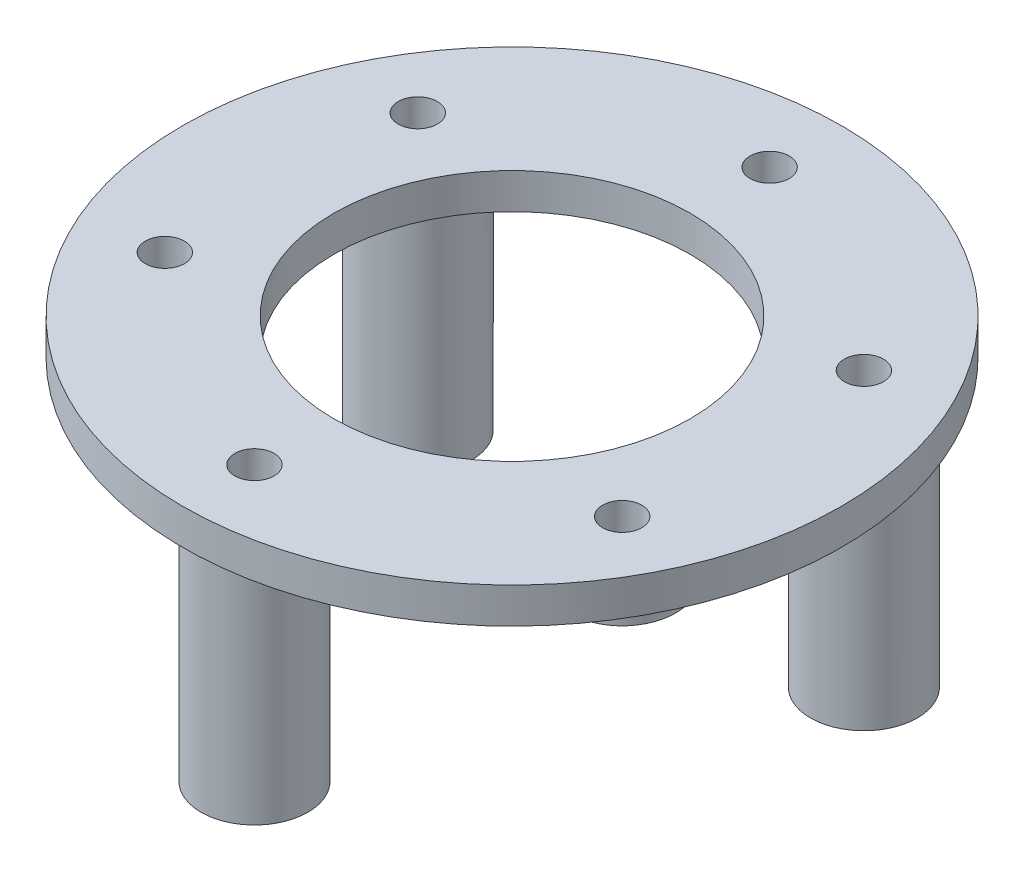
ISO-10303-21;
HEADER;
FILE_DESCRIPTION(('STEP AP214'),'2;1');
FILE_NAME('part.step','',(''),(''),'','','');
FILE_SCHEMA(('AUTOMOTIVE_DESIGN { 1 0 10303 214 1 1 1 1 }'));
ENDSEC;
DATA;
#1=APPLICATION_CONTEXT('core data for automotive mechanical design processes');
#2=APPLICATION_PROTOCOL_DEFINITION('international standard','automotive_design',2000,#1);
#3=PRODUCT_CONTEXT('',#1,'mechanical');
#4=PRODUCT('Part','Part','',(#3));
#5=PRODUCT_RELATED_PRODUCT_CATEGORY('part','',(#4));
#6=PRODUCT_DEFINITION_FORMATION('','',#4);
#7=PRODUCT_DEFINITION_CONTEXT('part definition',#1,'design');
#8=PRODUCT_DEFINITION('design','',#6,#7);
#9=PRODUCT_DEFINITION_SHAPE('','',#8);
#10=(LENGTH_UNIT() NAMED_UNIT(*) SI_UNIT(.MILLI.,.METRE.));
#11=(NAMED_UNIT(*) PLANE_ANGLE_UNIT() SI_UNIT($,.RADIAN.));
#12=(NAMED_UNIT(*) SI_UNIT($,.STERADIAN.) SOLID_ANGLE_UNIT());
#13=UNCERTAINTY_MEASURE_WITH_UNIT(LENGTH_MEASURE(1.E-05),#10,'distance_accuracy_value','');
#14=(GEOMETRIC_REPRESENTATION_CONTEXT(3) GLOBAL_UNCERTAINTY_ASSIGNED_CONTEXT((#13)) GLOBAL_UNIT_ASSIGNED_CONTEXT((#10,
#11,#12)) REPRESENTATION_CONTEXT('',''));
#15=CARTESIAN_POINT('',(0.,0.,0.));
#16=DIRECTION('',(0.,0.,1.));
#17=DIRECTION('',(1.,0.,0.));
#18=AXIS2_PLACEMENT_3D('',#15,#16,#17);
#19=CARTESIAN_POINT('',(0.,0.,0.));
#20=DIRECTION('',(0.,1.,0.));
#21=DIRECTION('',(0.,0.,1.));
#22=AXIS2_PLACEMENT_3D('',#19,#20,#21);
#23=PLANE('',#22);
#24=CARTESIAN_POINT('',(0.,0.,14.46));
#25=DIRECTION('',(0.,1.,0.));
#26=DIRECTION('',(0.,0.,1.));
#27=AXIS2_PLACEMENT_3D('',#24,#25,#26);
#28=CIRCLE('',#27,3.);
#29=CARTESIAN_POINT('',(0.,0.,17.46));
#30=VERTEX_POINT('',#29);
#31=EDGE_CURVE('E177',#30,#30,#28,.F.);
#32=ORIENTED_EDGE('',*,*,#31,.F.);
#33=EDGE_LOOP('',(#32));
#34=FACE_BOUND('',#33,.T.);
#35=CARTESIAN_POINT('',(0.,0.,0.));
#36=DIRECTION('',(0.,1.,0.));
#37=DIRECTION('',(0.,0.,1.));
#38=AXIS2_PLACEMENT_3D('',#35,#36,#37);
#39=CIRCLE('',#38,10.);
#40=CARTESIAN_POINT('',(0.,0.,10.));
#41=VERTEX_POINT('',#40);
#42=EDGE_CURVE('E162',#41,#41,#39,.T.);
#43=ORIENTED_EDGE('',*,*,#42,.T.);
#44=EDGE_LOOP('',(#43));
#45=FACE_BOUND('',#44,.T.);
#46=DIRECTION('',(-0.866025403784438,0.,0.5));
#47=VECTOR('',#46,1.);
#48=CARTESIAN_POINT('',(-6.38397459621556,0.,-13.0573683548744));
#49=LINE('',#48,#47);
#50=CARTESIAN_POINT('',(-6.38397459621556,0.,-13.0573683548744));
#51=VERTEX_POINT('',#50);
#52=CARTESIAN_POINT('',(-8.11602540378444,0.,-12.0573683548744));
#53=VERTEX_POINT('',#52);
#54=EDGE_CURVE('E79',#51,#53,#49,.T.);
#55=ORIENTED_EDGE('',*,*,#54,.F.);
#56=DIRECTION('',(0.5,0.,0.866025403784439));
#57=VECTOR('',#56,1.);
#58=CARTESIAN_POINT('',(-8.38397459621556,0.,-16.5214699700121));
#59=LINE('',#58,#57);
#60=CARTESIAN_POINT('',(-8.37045119717114,0.,-16.4980467557762));
#61=VERTEX_POINT('',#60);
#62=EDGE_CURVE('E90',#61,#51,#59,.T.);
#63=ORIENTED_EDGE('',*,*,#62,.F.);
#64=CARTESIAN_POINT('',(0.,0.,0.));
#65=DIRECTION('',(0.,1.,0.));
#66=DIRECTION('',(0.,0.,1.));
#67=AXIS2_PLACEMENT_3D('',#64,#65,#66);
#68=CIRCLE('',#67,18.5);
#69=CARTESIAN_POINT('',(-10.10250200474,0.,-15.4980467557762));
#70=VERTEX_POINT('',#69);
#71=EDGE_CURVE('E166',#70,#61,#68,.T.);
#72=ORIENTED_EDGE('',*,*,#71,.F.);
#73=DIRECTION('',(-0.5,0.,-0.866025403784438));
#74=VECTOR('',#73,1.);
#75=CARTESIAN_POINT('',(-10.1160254037844,0.,-15.5214699700121));
#76=LINE('',#75,#74);
#77=EDGE_CURVE('E92',#53,#70,#76,.T.);
#78=ORIENTED_EDGE('',*,*,#77,.F.);
#79=EDGE_LOOP('',(#55,#63,#72,#78));
#80=FACE_BOUND('',#79,.T.);
#81=CARTESIAN_POINT('',(0.,0.,-14.46));
#82=DIRECTION('',(0.,1.,0.));
#83=DIRECTION('',(0.,0.,1.));
#84=AXIS2_PLACEMENT_3D('',#81,#82,#83);
#85=CIRCLE('',#84,3.);
#86=CARTESIAN_POINT('',(0.,0.,-11.46));
#87=VERTEX_POINT('',#86);
#88=EDGE_CURVE('E147',#87,#87,#85,.T.);
#89=ORIENTED_EDGE('',*,*,#88,.T.);
#90=EDGE_LOOP('',(#89));
#91=FACE_BOUND('',#90,.T.);
#92=CARTESIAN_POINT('',(-12.8378104690723,0.,6.65448888797456));
#93=DIRECTION('',(0.,1.,0.));
#94=DIRECTION('',(0.,0.,1.));
#95=AXIS2_PLACEMENT_3D('',#92,#93,#94);
#96=CIRCLE('',#95,3.);
#97=CARTESIAN_POINT('',(-12.8378104690723,0.,9.65448888797456));
#98=VERTEX_POINT('',#97);
#99=EDGE_CURVE('E138',#98,#98,#96,.T.);
#100=ORIENTED_EDGE('',*,*,#99,.T.);
#101=EDGE_LOOP('',(#100));
#102=FACE_BOUND('',#101,.T.);
#103=CARTESIAN_POINT('',(12.8378104690723,0.,6.65448888797456));
#104=DIRECTION('',(0.,1.,0.));
#105=DIRECTION('',(0.,0.,1.));
#106=AXIS2_PLACEMENT_3D('',#103,#104,#105);
#107=CIRCLE('',#106,3.);
#108=CARTESIAN_POINT('',(12.8378104690723,0.,9.65448888797456));
#109=VERTEX_POINT('',#108);
#110=EDGE_CURVE('E129',#109,#109,#107,.T.);
#111=ORIENTED_EDGE('',*,*,#110,.T.);
#112=EDGE_LOOP('',(#111));
#113=FACE_BOUND('',#112,.T.);
#114=CARTESIAN_POINT('',(-12.5227273387229,0.,-7.23000000000006));
#115=DIRECTION('',(0.,1.,0.));
#116=DIRECTION('',(0.,0.,1.));
#117=AXIS2_PLACEMENT_3D('',#114,#115,#116);
#118=CIRCLE('',#117,3.);
#119=CARTESIAN_POINT('',(-12.5227273387229,0.,-4.23000000000006));
#120=VERTEX_POINT('',#119);
#121=EDGE_CURVE('E172',#120,#120,#118,.F.);
#122=ORIENTED_EDGE('',*,*,#121,.F.);
#123=EDGE_LOOP('',(#122));
#124=FACE_BOUND('',#123,.T.);
#125=CARTESIAN_POINT('',(12.5227273387229,0.,-7.23000000000006));
#126=DIRECTION('',(0.,1.,0.));
#127=DIRECTION('',(0.,0.,1.));
#128=AXIS2_PLACEMENT_3D('',#125,#126,#127);
#129=CIRCLE('',#128,3.);
#130=CARTESIAN_POINT('',(12.5227273387229,0.,-4.23000000000007));
#131=VERTEX_POINT('',#130);
#132=EDGE_CURVE('E180',#131,#131,#129,.F.);
#133=ORIENTED_EDGE('',*,*,#132,.F.);
#134=EDGE_LOOP('',(#133));
#135=FACE_BOUND('',#134,.T.);
#136=ADVANCED_FACE('F33',(#34,#45,#80,#91,#102,#113,#124,#135),#23,.F.);
#137=CARTESIAN_POINT('',(0.,2.,0.));
#138=DIRECTION('',(0.,1.,0.));
#139=DIRECTION('',(0.,0.,1.));
#140=AXIS2_PLACEMENT_3D('',#137,#138,#139);
#141=PLANE('',#140);
#142=CARTESIAN_POINT('',(-12.5227273387229,2.,-7.23000000000006));
#143=DIRECTION('',(0.,1.,0.));
#144=DIRECTION('',(0.,0.,1.));
#145=AXIS2_PLACEMENT_3D('',#142,#143,#144);
#146=CIRCLE('',#145,1.10000000000001);
#147=CARTESIAN_POINT('',(-12.5227273387229,2.,-6.13000000000005));
#148=VERTEX_POINT('',#147);
#149=EDGE_CURVE('E118',#148,#148,#146,.T.);
#150=ORIENTED_EDGE('',*,*,#149,.F.);
#151=EDGE_LOOP('',(#150));
#152=FACE_BOUND('',#151,.T.);
#153=CARTESIAN_POINT('',(12.5227273387229,2.,-7.23000000000006));
#154=DIRECTION('',(0.,1.,0.));
#155=DIRECTION('',(0.,0.,1.));
#156=AXIS2_PLACEMENT_3D('',#153,#154,#155);
#157=CIRCLE('',#156,1.1);
#158=CARTESIAN_POINT('',(12.5227273387229,2.,-6.13000000000006));
#159=VERTEX_POINT('',#158);
#160=EDGE_CURVE('E122',#159,#159,#157,.T.);
#161=ORIENTED_EDGE('',*,*,#160,.F.);
#162=EDGE_LOOP('',(#161));
#163=FACE_BOUND('',#162,.T.);
#164=CARTESIAN_POINT('',(0.,2.,14.46));
#165=DIRECTION('',(0.,1.,0.));
#166=DIRECTION('',(0.,0.,1.));
#167=AXIS2_PLACEMENT_3D('',#164,#165,#166);
#168=CIRCLE('',#167,1.1);
#169=CARTESIAN_POINT('',(0.,2.,15.56));
#170=VERTEX_POINT('',#169);
#171=EDGE_CURVE('E117',#170,#170,#168,.T.);
#172=ORIENTED_EDGE('',*,*,#171,.F.);
#173=EDGE_LOOP('',(#172));
#174=FACE_BOUND('',#173,.T.);
#175=CARTESIAN_POINT('',(12.8378104690723,2.,6.65448888797456));
#176=DIRECTION('',(0.,1.,0.));
#177=DIRECTION('',(0.,0.,1.));
#178=AXIS2_PLACEMENT_3D('',#175,#176,#177);
#179=CIRCLE('',#178,1.1);
#180=CARTESIAN_POINT('',(12.8378104690723,2.,7.75448888797456));
#181=VERTEX_POINT('',#180);
#182=EDGE_CURVE('E156',#181,#181,#179,.T.);
#183=ORIENTED_EDGE('',*,*,#182,.F.);
#184=EDGE_LOOP('',(#183));
#185=FACE_BOUND('',#184,.T.);
#186=CARTESIAN_POINT('',(0.,2.,0.));
#187=DIRECTION('',(0.,1.,0.));
#188=DIRECTION('',(0.,0.,1.));
#189=AXIS2_PLACEMENT_3D('',#186,#187,#188);
#190=CIRCLE('',#189,10.);
#191=CARTESIAN_POINT('',(0.,2.,10.));
#192=VERTEX_POINT('',#191);
#193=EDGE_CURVE('E163',#192,#192,#190,.T.);
#194=ORIENTED_EDGE('',*,*,#193,.F.);
#195=EDGE_LOOP('',(#194));
#196=FACE_BOUND('',#195,.T.);
#197=CARTESIAN_POINT('',(0.,2.,0.));
#198=DIRECTION('',(0.,1.,0.));
#199=DIRECTION('',(0.,0.,1.));
#200=AXIS2_PLACEMENT_3D('',#197,#198,#199);
#201=CIRCLE('',#200,18.5);
#202=CARTESIAN_POINT('',(0.,2.,18.5));
#203=VERTEX_POINT('',#202);
#204=EDGE_CURVE('E169',#203,#203,#201,.T.);
#205=ORIENTED_EDGE('',*,*,#204,.T.);
#206=EDGE_LOOP('',(#205));
#207=FACE_BOUND('',#206,.T.);
#208=CARTESIAN_POINT('',(0.,2.,-14.46));
#209=DIRECTION('',(0.,1.,0.));
#210=DIRECTION('',(0.,0.,1.));
#211=AXIS2_PLACEMENT_3D('',#208,#209,#210);
#212=CIRCLE('',#211,1.1);
#213=CARTESIAN_POINT('',(0.,2.,-13.36));
#214=VERTEX_POINT('',#213);
#215=EDGE_CURVE('E159',#214,#214,#212,.T.);
#216=ORIENTED_EDGE('',*,*,#215,.F.);
#217=EDGE_LOOP('',(#216));
#218=FACE_BOUND('',#217,.T.);
#219=CARTESIAN_POINT('',(-12.8378104690723,2.,6.65448888797456));
#220=DIRECTION('',(0.,1.,0.));
#221=DIRECTION('',(0.,0.,1.));
#222=AXIS2_PLACEMENT_3D('',#219,#220,#221);
#223=CIRCLE('',#222,1.1);
#224=CARTESIAN_POINT('',(-12.8378104690723,2.,7.75448888797456));
#225=VERTEX_POINT('',#224);
#226=EDGE_CURVE('E151',#225,#225,#223,.T.);
#227=ORIENTED_EDGE('',*,*,#226,.F.);
#228=EDGE_LOOP('',(#227));
#229=FACE_BOUND('',#228,.T.);
#230=ADVANCED_FACE('F204',(#152,#163,#174,#185,#196,#207,#218,#229),#141,.T.);
#231=CARTESIAN_POINT('',(0.,2.,0.));
#232=DIRECTION('',(0.,-1.,0.));
#233=DIRECTION('',(0.,0.,-1.));
#234=AXIS2_PLACEMENT_3D('',#231,#232,#233);
#235=CYLINDRICAL_SURFACE('',#234,18.5);
#236=ORIENTED_EDGE('',*,*,#71,.T.);
#237=DIRECTION('',(0.,-1.,0.));
#238=VECTOR('',#237,1.);
#239=CARTESIAN_POINT('',(-8.37045119717114,2.,-16.4980467557762));
#240=LINE('',#239,#238);
#241=CARTESIAN_POINT('',(-8.37045119717114,0.44,-16.4980467557762));
#242=VERTEX_POINT('',#241);
#243=EDGE_CURVE('E11',#61,#242,#240,.F.);
#244=ORIENTED_EDGE('',*,*,#243,.T.);
#245=CARTESIAN_POINT('',(0.,0.44,0.));
#246=DIRECTION('',(0.,1.,0.));
#247=DIRECTION('',(0.,0.,1.));
#248=AXIS2_PLACEMENT_3D('',#245,#246,#247);
#249=CIRCLE('',#248,18.5);
#250=CARTESIAN_POINT('',(-10.10250200474,0.44,-15.4980467557762));
#251=VERTEX_POINT('',#250);
#252=EDGE_CURVE('E53',#242,#251,#249,.T.);
#253=ORIENTED_EDGE('',*,*,#252,.T.);
#254=DIRECTION('',(0.,-1.,0.));
#255=VECTOR('',#254,1.);
#256=CARTESIAN_POINT('',(-10.10250200474,2.,-15.4980467557762));
#257=LINE('',#256,#255);
#258=EDGE_CURVE('E41',#251,#70,#257,.T.);
#259=ORIENTED_EDGE('',*,*,#258,.T.);
#260=EDGE_LOOP('',(#236,#244,#253,#259));
#261=FACE_BOUND('',#260,.T.);
#262=ORIENTED_EDGE('',*,*,#204,.F.);
#263=EDGE_LOOP('',(#262));
#264=FACE_BOUND('',#263,.T.);
#265=ADVANCED_FACE('F35',(#261,#264),#235,.T.);
#266=CARTESIAN_POINT('',(0.,2.,0.));
#267=DIRECTION('',(0.,-1.,0.));
#268=DIRECTION('',(0.,0.,-1.));
#269=AXIS2_PLACEMENT_3D('',#266,#267,#268);
#270=CYLINDRICAL_SURFACE('',#269,10.);
#271=ORIENTED_EDGE('',*,*,#193,.T.);
#272=EDGE_LOOP('',(#271));
#273=FACE_BOUND('',#272,.T.);
#274=ORIENTED_EDGE('',*,*,#42,.F.);
#275=EDGE_LOOP('',(#274));
#276=FACE_BOUND('',#275,.T.);
#277=ADVANCED_FACE('F216',(#273,#276),#270,.F.);
#278=CARTESIAN_POINT('',(0.,2.,-14.46));
#279=DIRECTION('',(0.,-1.,0.));
#280=DIRECTION('',(0.,0.,-1.));
#281=AXIS2_PLACEMENT_3D('',#278,#279,#280);
#282=CYLINDRICAL_SURFACE('',#281,1.1);
#283=ORIENTED_EDGE('',*,*,#215,.T.);
#284=EDGE_LOOP('',(#283));
#285=FACE_BOUND('',#284,.T.);
#286=CARTESIAN_POINT('',(0.,-1.2,-14.46));
#287=DIRECTION('',(0.,1.,0.));
#288=DIRECTION('',(0.,0.,1.));
#289=AXIS2_PLACEMENT_3D('',#286,#287,#288);
#290=CIRCLE('',#289,1.1);
#291=CARTESIAN_POINT('',(0.,-1.2,-13.36));
#292=VERTEX_POINT('',#291);
#293=EDGE_CURVE('E142',#292,#292,#290,.T.);
#294=ORIENTED_EDGE('',*,*,#293,.F.);
#295=EDGE_LOOP('',(#294));
#296=FACE_BOUND('',#295,.T.);
#297=ADVANCED_FACE('F219',(#285,#296),#282,.F.);
#298=CARTESIAN_POINT('',(12.8378104690723,2.,6.65448888797456));
#299=DIRECTION('',(0.,-1.,0.));
#300=DIRECTION('',(0.,0.,-1.));
#301=AXIS2_PLACEMENT_3D('',#298,#299,#300);
#302=CYLINDRICAL_SURFACE('',#301,1.1);
#303=ORIENTED_EDGE('',*,*,#182,.T.);
#304=EDGE_LOOP('',(#303));
#305=FACE_BOUND('',#304,.T.);
#306=CARTESIAN_POINT('',(12.8378104690723,-1.2,6.65448888797456));
#307=DIRECTION('',(0.,1.,0.));
#308=DIRECTION('',(0.,0.,1.));
#309=AXIS2_PLACEMENT_3D('',#306,#307,#308);
#310=CIRCLE('',#309,1.1);
#311=CARTESIAN_POINT('',(12.8378104690723,-1.2,7.75448888797456));
#312=VERTEX_POINT('',#311);
#313=EDGE_CURVE('E121',#312,#312,#310,.T.);
#314=ORIENTED_EDGE('',*,*,#313,.F.);
#315=EDGE_LOOP('',(#314));
#316=FACE_BOUND('',#315,.T.);
#317=ADVANCED_FACE('F223',(#305,#316),#302,.F.);
#318=CARTESIAN_POINT('',(-12.8378104690723,2.,6.65448888797456));
#319=DIRECTION('',(0.,-1.,0.));
#320=DIRECTION('',(0.,0.,-1.));
#321=AXIS2_PLACEMENT_3D('',#318,#319,#320);
#322=CYLINDRICAL_SURFACE('',#321,1.1);
#323=ORIENTED_EDGE('',*,*,#226,.T.);
#324=EDGE_LOOP('',(#323));
#325=FACE_BOUND('',#324,.T.);
#326=CARTESIAN_POINT('',(-12.8378104690723,-1.2,6.65448888797456));
#327=DIRECTION('',(0.,1.,0.));
#328=DIRECTION('',(0.,0.,1.));
#329=AXIS2_PLACEMENT_3D('',#326,#327,#328);
#330=CIRCLE('',#329,1.1);
#331=CARTESIAN_POINT('',(-12.8378104690723,-1.2,7.75448888797456));
#332=VERTEX_POINT('',#331);
#333=EDGE_CURVE('E133',#332,#332,#330,.T.);
#334=ORIENTED_EDGE('',*,*,#333,.F.);
#335=EDGE_LOOP('',(#334));
#336=FACE_BOUND('',#335,.T.);
#337=ADVANCED_FACE('F227',(#325,#336),#322,.F.);
#338=CARTESIAN_POINT('',(0.,-1.2,-14.46));
#339=DIRECTION('',(0.,1.,0.));
#340=DIRECTION('',(0.,0.,1.));
#341=AXIS2_PLACEMENT_3D('',#338,#339,#340);
#342=CYLINDRICAL_SURFACE('',#341,3.);
#343=CARTESIAN_POINT('',(0.,-1.2,-14.46));
#344=DIRECTION('',(0.,1.,0.));
#345=DIRECTION('',(0.,0.,1.));
#346=AXIS2_PLACEMENT_3D('',#343,#344,#345);
#347=CIRCLE('',#346,3.);
#348=CARTESIAN_POINT('',(0.,-1.2,-11.46));
#349=VERTEX_POINT('',#348);
#350=EDGE_CURVE('E148',#349,#349,#347,.T.);
#351=ORIENTED_EDGE('',*,*,#350,.T.);
#352=EDGE_LOOP('',(#351));
#353=FACE_BOUND('',#352,.T.);
#354=ORIENTED_EDGE('',*,*,#88,.F.);
#355=EDGE_LOOP('',(#354));
#356=FACE_BOUND('',#355,.T.);
#357=ADVANCED_FACE('F231',(#353,#356),#342,.T.);
#358=CARTESIAN_POINT('',(0.,-1.2,-14.46));
#359=DIRECTION('',(0.,1.,0.));
#360=DIRECTION('',(0.,0.,1.));
#361=AXIS2_PLACEMENT_3D('',#358,#359,#360);
#362=PLANE('',#361);
#363=ORIENTED_EDGE('',*,*,#293,.T.);
#364=EDGE_LOOP('',(#363));
#365=FACE_BOUND('',#364,.T.);
#366=ORIENTED_EDGE('',*,*,#350,.F.);
#367=EDGE_LOOP('',(#366));
#368=FACE_BOUND('',#367,.T.);
#369=ADVANCED_FACE('F235',(#365,#368),#362,.F.);
#370=CARTESIAN_POINT('',(-12.8378104690723,-1.2,6.65448888797456));
#371=DIRECTION('',(0.,1.,0.));
#372=DIRECTION('',(0.,0.,1.));
#373=AXIS2_PLACEMENT_3D('',#370,#371,#372);
#374=CYLINDRICAL_SURFACE('',#373,3.);
#375=CARTESIAN_POINT('',(-12.8378104690723,-1.2,6.65448888797456));
#376=DIRECTION('',(0.,1.,0.));
#377=DIRECTION('',(0.,0.,1.));
#378=AXIS2_PLACEMENT_3D('',#375,#376,#377);
#379=CIRCLE('',#378,3.);
#380=CARTESIAN_POINT('',(-12.8378104690723,-1.2,9.65448888797456));
#381=VERTEX_POINT('',#380);
#382=EDGE_CURVE('E139',#381,#381,#379,.T.);
#383=ORIENTED_EDGE('',*,*,#382,.T.);
#384=EDGE_LOOP('',(#383));
#385=FACE_BOUND('',#384,.T.);
#386=ORIENTED_EDGE('',*,*,#99,.F.);
#387=EDGE_LOOP('',(#386));
#388=FACE_BOUND('',#387,.T.);
#389=ADVANCED_FACE('F239',(#385,#388),#374,.T.);
#390=CARTESIAN_POINT('',(-12.8378104690723,-1.2,6.65448888797456));
#391=DIRECTION('',(0.,1.,0.));
#392=DIRECTION('',(0.,0.,1.));
#393=AXIS2_PLACEMENT_3D('',#390,#391,#392);
#394=PLANE('',#393);
#395=ORIENTED_EDGE('',*,*,#333,.T.);
#396=EDGE_LOOP('',(#395));
#397=FACE_BOUND('',#396,.T.);
#398=ORIENTED_EDGE('',*,*,#382,.F.);
#399=EDGE_LOOP('',(#398));
#400=FACE_BOUND('',#399,.T.);
#401=ADVANCED_FACE('F243',(#397,#400),#394,.F.);
#402=CARTESIAN_POINT('',(12.8378104690723,-1.2,6.65448888797456));
#403=DIRECTION('',(0.,1.,0.));
#404=DIRECTION('',(0.,0.,1.));
#405=AXIS2_PLACEMENT_3D('',#402,#403,#404);
#406=CYLINDRICAL_SURFACE('',#405,3.);
#407=CARTESIAN_POINT('',(12.8378104690723,-1.2,6.65448888797456));
#408=DIRECTION('',(0.,1.,0.));
#409=DIRECTION('',(0.,0.,1.));
#410=AXIS2_PLACEMENT_3D('',#407,#408,#409);
#411=CIRCLE('',#410,3.);
#412=CARTESIAN_POINT('',(12.8378104690723,-1.2,9.65448888797456));
#413=VERTEX_POINT('',#412);
#414=EDGE_CURVE('E130',#413,#413,#411,.T.);
#415=ORIENTED_EDGE('',*,*,#414,.T.);
#416=EDGE_LOOP('',(#415));
#417=FACE_BOUND('',#416,.T.);
#418=ORIENTED_EDGE('',*,*,#110,.F.);
#419=EDGE_LOOP('',(#418));
#420=FACE_BOUND('',#419,.T.);
#421=ADVANCED_FACE('F247',(#417,#420),#406,.T.);
#422=CARTESIAN_POINT('',(12.8378104690723,-1.2,6.65448888797456));
#423=DIRECTION('',(0.,1.,0.));
#424=DIRECTION('',(0.,0.,1.));
#425=AXIS2_PLACEMENT_3D('',#422,#423,#424);
#426=PLANE('',#425);
#427=ORIENTED_EDGE('',*,*,#313,.T.);
#428=EDGE_LOOP('',(#427));
#429=FACE_BOUND('',#428,.T.);
#430=ORIENTED_EDGE('',*,*,#414,.F.);
#431=EDGE_LOOP('',(#430));
#432=FACE_BOUND('',#431,.T.);
#433=ADVANCED_FACE('F251',(#429,#432),#426,.F.);
#434=CARTESIAN_POINT('',(0.,-1.2,14.46));
#435=DIRECTION('',(0.,1.,0.));
#436=DIRECTION('',(0.,0.,1.));
#437=AXIS2_PLACEMENT_3D('',#434,#435,#436);
#438=CYLINDRICAL_SURFACE('',#437,1.1);
#439=CARTESIAN_POINT('',(0.,-13.4,14.46));
#440=DIRECTION('',(0.,-1.,0.));
#441=DIRECTION('',(0.,0.,-1.));
#442=AXIS2_PLACEMENT_3D('',#439,#440,#441);
#443=CIRCLE('',#442,1.1);
#444=CARTESIAN_POINT('',(0.,-13.4,15.56));
#445=VERTEX_POINT('',#444);
#446=EDGE_CURVE('E105',#445,#445,#443,.T.);
#447=CARTESIAN_POINT('',(0.,2.,15.56));
#448=CARTESIAN_POINT('',(0.,1.83958333333333,15.56));
#449=CARTESIAN_POINT('',(0.,1.67916666666667,15.56));
#450=CARTESIAN_POINT('',(0.,1.35833333333333,15.56));
#451=CARTESIAN_POINT('',(0.,1.19791666666667,15.56));
#452=CARTESIAN_POINT('',(0.,0.877083333333333,15.56));
#453=CARTESIAN_POINT('',(0.,0.716666666666666,15.56));
#454=CARTESIAN_POINT('',(0.,0.395833333333333,15.56));
#455=CARTESIAN_POINT('',(0.,0.235416666666666,15.56));
#456=CARTESIAN_POINT('',(0.,-0.0854166666666672,15.56));
#457=CARTESIAN_POINT('',(0.,-0.245833333333334,15.56));
#458=CARTESIAN_POINT('',(0.,-0.566666666666667,15.56));
#459=CARTESIAN_POINT('',(0.,-0.727083333333334,15.56));
#460=CARTESIAN_POINT('',(0.,-1.04791666666667,15.56));
#461=CARTESIAN_POINT('',(0.,-1.20833333333333,15.56));
#462=CARTESIAN_POINT('',(0.,-1.52916666666667,15.56));
#463=CARTESIAN_POINT('',(0.,-1.68958333333333,15.56));
#464=CARTESIAN_POINT('',(0.,-2.01041666666667,15.56));
#465=CARTESIAN_POINT('',(0.,-2.17083333333333,15.56));
#466=CARTESIAN_POINT('',(0.,-2.49166666666667,15.56));
#467=CARTESIAN_POINT('',(0.,-2.65208333333333,15.56));
#468=CARTESIAN_POINT('',(0.,-2.97291666666667,15.56));
#469=CARTESIAN_POINT('',(0.,-3.13333333333333,15.56));
#470=CARTESIAN_POINT('',(0.,-3.45416666666667,15.56));
#471=CARTESIAN_POINT('',(0.,-3.61458333333333,15.56));
#472=CARTESIAN_POINT('',(0.,-3.93541666666667,15.56));
#473=CARTESIAN_POINT('',(0.,-4.09583333333333,15.56));
#474=CARTESIAN_POINT('',(0.,-4.41666666666667,15.56));
#475=CARTESIAN_POINT('',(0.,-4.57708333333333,15.56));
#476=CARTESIAN_POINT('',(0.,-4.89791666666667,15.56));
#477=CARTESIAN_POINT('',(0.,-5.05833333333333,15.56));
#478=CARTESIAN_POINT('',(0.,-5.37916666666667,15.56));
#479=CARTESIAN_POINT('',(0.,-5.53958333333333,15.56));
#480=CARTESIAN_POINT('',(0.,-5.86041666666667,15.56));
#481=CARTESIAN_POINT('',(0.,-6.02083333333333,15.56));
#482=CARTESIAN_POINT('',(0.,-6.34166666666667,15.56));
#483=CARTESIAN_POINT('',(0.,-6.50208333333333,15.56));
#484=CARTESIAN_POINT('',(0.,-6.82291666666667,15.56));
#485=CARTESIAN_POINT('',(0.,-6.98333333333333,15.56));
#486=CARTESIAN_POINT('',(0.,-7.30416666666667,15.56));
#487=CARTESIAN_POINT('',(0.,-7.46458333333333,15.56));
#488=CARTESIAN_POINT('',(0.,-7.78541666666667,15.56));
#489=CARTESIAN_POINT('',(0.,-7.94583333333333,15.56));
#490=CARTESIAN_POINT('',(0.,-8.26666666666667,15.56));
#491=CARTESIAN_POINT('',(0.,-8.42708333333333,15.56));
#492=CARTESIAN_POINT('',(0.,-8.74791666666667,15.56));
#493=CARTESIAN_POINT('',(0.,-8.90833333333333,15.56));
#494=CARTESIAN_POINT('',(0.,-9.22916666666667,15.56));
#495=CARTESIAN_POINT('',(0.,-9.38958333333333,15.56));
#496=CARTESIAN_POINT('',(0.,-9.71041666666667,15.56));
#497=CARTESIAN_POINT('',(0.,-9.87083333333333,15.56));
#498=CARTESIAN_POINT('',(0.,-10.1916666666667,15.56));
#499=CARTESIAN_POINT('',(0.,-10.3520833333333,15.56));
#500=CARTESIAN_POINT('',(0.,-10.6729166666667,15.56));
#501=CARTESIAN_POINT('',(0.,-10.8333333333333,15.56));
#502=CARTESIAN_POINT('',(0.,-11.1541666666667,15.56));
#503=CARTESIAN_POINT('',(0.,-11.3145833333333,15.56));
#504=CARTESIAN_POINT('',(0.,-11.6354166666667,15.56));
#505=CARTESIAN_POINT('',(0.,-11.7958333333333,15.56));
#506=CARTESIAN_POINT('',(0.,-12.1166666666667,15.56));
#507=CARTESIAN_POINT('',(0.,-12.2770833333333,15.56));
#508=CARTESIAN_POINT('',(0.,-12.5979166666667,15.56));
#509=CARTESIAN_POINT('',(0.,-12.7583333333333,15.56));
#510=CARTESIAN_POINT('',(0.,-13.0791666666667,15.56));
#511=CARTESIAN_POINT('',(0.,-13.2395833333333,15.56));
#512=CARTESIAN_POINT('',(0.,-13.4,15.56));
#513=B_SPLINE_CURVE_WITH_KNOTS('',3,(#447,#448,#449,#450,#451,#452,#453,#454,#455,#456,#457,
#458,#459,#460,#461,#462,#463,#464,#465,#466,#467,#468,#469,#470,#471,#472,#473,#474,#475,#476,
#477,#478,#479,#480,#481,#482,#483,#484,#485,#486,#487,#488,#489,#490,#491,#492,#493,#494,#495,
#496,#497,#498,#499,#500,#501,#502,#503,#504,#505,#506,#507,#508,#509,#510,#511,#512),
.UNSPECIFIED.,.F.,.F.,(4,2,2,2,2,2,2,2,2,2,2,2,2,2,2,2,2,2,2,2,2,2,2,2,2,2,2,2,2,2,2,2,4),(0.,
0.48125,0.9625,1.44375,1.925,2.40625,2.8875,3.36875,3.85,4.33125,4.8125,5.29375,5.775,6.25625,
6.7375,7.21875,7.7,8.18125,8.6625,9.14375,9.625,10.10625,10.5875,11.06875,11.55,12.03125,
12.5125,12.99375,13.475,13.95625,14.4375,14.91875,15.4),.UNSPECIFIED.);
#514=EDGE_CURVE('BSEAM255',#170,#445,#513,.T.);
#515=ORIENTED_EDGE('',*,*,#171,.T.);
#516=ORIENTED_EDGE('',*,*,#446,.T.);
#517=ORIENTED_EDGE('',*,*,#514,.T.);
#518=ORIENTED_EDGE('',*,*,#514,.F.);
#519=EDGE_LOOP('',(#515,#517,#516,#518));
#520=FACE_BOUND('',#519,.T.);
#521=ADVANCED_FACE('F255',(#520),#438,.F.);
#522=CARTESIAN_POINT('',(12.5227273387229,-1.2,-7.23000000000006));
#523=DIRECTION('',(0.,1.,0.));
#524=DIRECTION('',(0.,0.,1.));
#525=AXIS2_PLACEMENT_3D('',#522,#523,#524);
#526=CYLINDRICAL_SURFACE('',#525,1.1);
#527=CARTESIAN_POINT('',(12.5227273387229,-13.4,-7.23000000000006));
#528=DIRECTION('',(0.,-1.,0.));
#529=DIRECTION('',(0.,0.,-1.));
#530=AXIS2_PLACEMENT_3D('',#527,#528,#529);
#531=CIRCLE('',#530,1.1);
#532=CARTESIAN_POINT('',(12.5227273387229,-13.4,-6.13000000000006));
#533=VERTEX_POINT('',#532);
#534=EDGE_CURVE('E98',#533,#533,#531,.T.);
#535=CARTESIAN_POINT('',(12.5227273387229,2.,-6.13000000000006));
#536=CARTESIAN_POINT('',(12.5227273387229,1.83958333333333,-6.13000000000006));
#537=CARTESIAN_POINT('',(12.5227273387229,1.67916666666667,-6.13000000000006));
#538=CARTESIAN_POINT('',(12.5227273387229,1.35833333333333,-6.13000000000006));
#539=CARTESIAN_POINT('',(12.5227273387229,1.19791666666667,-6.13000000000006));
#540=CARTESIAN_POINT('',(12.5227273387229,0.877083333333333,-6.13000000000006));
#541=CARTESIAN_POINT('',(12.5227273387229,0.716666666666666,-6.13000000000006));
#542=CARTESIAN_POINT('',(12.5227273387229,0.395833333333333,-6.13000000000006));
#543=CARTESIAN_POINT('',(12.5227273387229,0.235416666666666,-6.13000000000006));
#544=CARTESIAN_POINT('',(12.5227273387229,-0.0854166666666672,-6.13000000000006));
#545=CARTESIAN_POINT('',(12.5227273387229,-0.245833333333334,-6.13000000000006));
#546=CARTESIAN_POINT('',(12.5227273387229,-0.566666666666667,-6.13000000000006));
#547=CARTESIAN_POINT('',(12.5227273387229,-0.727083333333334,-6.13000000000006));
#548=CARTESIAN_POINT('',(12.5227273387229,-1.04791666666667,-6.13000000000006));
#549=CARTESIAN_POINT('',(12.5227273387229,-1.20833333333333,-6.13000000000006));
#550=CARTESIAN_POINT('',(12.5227273387229,-1.52916666666667,-6.13000000000006));
#551=CARTESIAN_POINT('',(12.5227273387229,-1.68958333333333,-6.13000000000006));
#552=CARTESIAN_POINT('',(12.5227273387229,-2.01041666666667,-6.13000000000006));
#553=CARTESIAN_POINT('',(12.5227273387229,-2.17083333333333,-6.13000000000006));
#554=CARTESIAN_POINT('',(12.5227273387229,-2.49166666666667,-6.13000000000006));
#555=CARTESIAN_POINT('',(12.5227273387229,-2.65208333333333,-6.13000000000006));
#556=CARTESIAN_POINT('',(12.5227273387229,-2.97291666666667,-6.13000000000006));
#557=CARTESIAN_POINT('',(12.5227273387229,-3.13333333333333,-6.13000000000006));
#558=CARTESIAN_POINT('',(12.5227273387229,-3.45416666666667,-6.13000000000006));
#559=CARTESIAN_POINT('',(12.5227273387229,-3.61458333333333,-6.13000000000006));
#560=CARTESIAN_POINT('',(12.5227273387229,-3.93541666666667,-6.13000000000006));
#561=CARTESIAN_POINT('',(12.5227273387229,-4.09583333333333,-6.13000000000006));
#562=CARTESIAN_POINT('',(12.5227273387229,-4.41666666666667,-6.13000000000006));
#563=CARTESIAN_POINT('',(12.5227273387229,-4.57708333333333,-6.13000000000006));
#564=CARTESIAN_POINT('',(12.5227273387229,-4.89791666666667,-6.13000000000006));
#565=CARTESIAN_POINT('',(12.5227273387229,-5.05833333333333,-6.13000000000006));
#566=CARTESIAN_POINT('',(12.5227273387229,-5.37916666666667,-6.13000000000006));
#567=CARTESIAN_POINT('',(12.5227273387229,-5.53958333333333,-6.13000000000006));
#568=CARTESIAN_POINT('',(12.5227273387229,-5.86041666666667,-6.13000000000006));
#569=CARTESIAN_POINT('',(12.5227273387229,-6.02083333333333,-6.13000000000006));
#570=CARTESIAN_POINT('',(12.5227273387229,-6.34166666666667,-6.13000000000006));
#571=CARTESIAN_POINT('',(12.5227273387229,-6.50208333333333,-6.13000000000006));
#572=CARTESIAN_POINT('',(12.5227273387229,-6.82291666666667,-6.13000000000006));
#573=CARTESIAN_POINT('',(12.5227273387229,-6.98333333333333,-6.13000000000006));
#574=CARTESIAN_POINT('',(12.5227273387229,-7.30416666666667,-6.13000000000006));
#575=CARTESIAN_POINT('',(12.5227273387229,-7.46458333333333,-6.13000000000006));
#576=CARTESIAN_POINT('',(12.5227273387229,-7.78541666666667,-6.13000000000006));
#577=CARTESIAN_POINT('',(12.5227273387229,-7.94583333333333,-6.13000000000006));
#578=CARTESIAN_POINT('',(12.5227273387229,-8.26666666666667,-6.13000000000006));
#579=CARTESIAN_POINT('',(12.5227273387229,-8.42708333333333,-6.13000000000006));
#580=CARTESIAN_POINT('',(12.5227273387229,-8.74791666666667,-6.13000000000006));
#581=CARTESIAN_POINT('',(12.5227273387229,-8.90833333333333,-6.13000000000006));
#582=CARTESIAN_POINT('',(12.5227273387229,-9.22916666666667,-6.13000000000006));
#583=CARTESIAN_POINT('',(12.5227273387229,-9.38958333333333,-6.13000000000006));
#584=CARTESIAN_POINT('',(12.5227273387229,-9.71041666666667,-6.13000000000006));
#585=CARTESIAN_POINT('',(12.5227273387229,-9.87083333333333,-6.13000000000006));
#586=CARTESIAN_POINT('',(12.5227273387229,-10.1916666666667,-6.13000000000006));
#587=CARTESIAN_POINT('',(12.5227273387229,-10.3520833333333,-6.13000000000006));
#588=CARTESIAN_POINT('',(12.5227273387229,-10.6729166666667,-6.13000000000006));
#589=CARTESIAN_POINT('',(12.5227273387229,-10.8333333333333,-6.13000000000006));
#590=CARTESIAN_POINT('',(12.5227273387229,-11.1541666666667,-6.13000000000006));
#591=CARTESIAN_POINT('',(12.5227273387229,-11.3145833333333,-6.13000000000006));
#592=CARTESIAN_POINT('',(12.5227273387229,-11.6354166666667,-6.13000000000006));
#593=CARTESIAN_POINT('',(12.5227273387229,-11.7958333333333,-6.13000000000006));
#594=CARTESIAN_POINT('',(12.5227273387229,-12.1166666666667,-6.13000000000006));
#595=CARTESIAN_POINT('',(12.5227273387229,-12.2770833333333,-6.13000000000006));
#596=CARTESIAN_POINT('',(12.5227273387229,-12.5979166666667,-6.13000000000006));
#597=CARTESIAN_POINT('',(12.5227273387229,-12.7583333333333,-6.13000000000006));
#598=CARTESIAN_POINT('',(12.5227273387229,-13.0791666666667,-6.13000000000006));
#599=CARTESIAN_POINT('',(12.5227273387229,-13.2395833333333,-6.13000000000006));
#600=CARTESIAN_POINT('',(12.5227273387229,-13.4,-6.13000000000006));
#601=B_SPLINE_CURVE_WITH_KNOTS('',3,(#535,#536,#537,#538,#539,#540,#541,#542,#543,#544,#545,
#546,#547,#548,#549,#550,#551,#552,#553,#554,#555,#556,#557,#558,#559,#560,#561,#562,#563,#564,
#565,#566,#567,#568,#569,#570,#571,#572,#573,#574,#575,#576,#577,#578,#579,#580,#581,#582,#583,
#584,#585,#586,#587,#588,#589,#590,#591,#592,#593,#594,#595,#596,#597,#598,#599,#600),
.UNSPECIFIED.,.F.,.F.,(4,2,2,2,2,2,2,2,2,2,2,2,2,2,2,2,2,2,2,2,2,2,2,2,2,2,2,2,2,2,2,2,4),(0.,
0.48125,0.9625,1.44375,1.925,2.40625,2.8875,3.36875,3.85,4.33125,4.8125,5.29375,5.775,6.25625,
6.7375,7.21875,7.7,8.18125,8.6625,9.14375,9.625,10.10625,10.5875,11.06875,11.55,12.03125,
12.5125,12.99375,13.475,13.95625,14.4375,14.91875,15.4),.UNSPECIFIED.);
#602=EDGE_CURVE('BSEAM259',#159,#533,#601,.T.);
#603=ORIENTED_EDGE('',*,*,#160,.T.);
#604=ORIENTED_EDGE('',*,*,#534,.T.);
#605=ORIENTED_EDGE('',*,*,#602,.T.);
#606=ORIENTED_EDGE('',*,*,#602,.F.);
#607=EDGE_LOOP('',(#603,#605,#604,#606));
#608=FACE_BOUND('',#607,.T.);
#609=ADVANCED_FACE('F259',(#608),#526,.F.);
#610=CARTESIAN_POINT('',(-12.5227273387229,-1.2,-7.23000000000006));
#611=DIRECTION('',(0.,1.,0.));
#612=DIRECTION('',(0.,0.,1.));
#613=AXIS2_PLACEMENT_3D('',#610,#611,#612);
#614=CYLINDRICAL_SURFACE('',#613,1.10000000000001);
#615=CARTESIAN_POINT('',(-12.5227273387229,-13.4,-7.23000000000006));
#616=DIRECTION('',(0.,-1.,0.));
#617=DIRECTION('',(0.,0.,-1.));
#618=AXIS2_PLACEMENT_3D('',#615,#616,#617);
#619=CIRCLE('',#618,1.1);
#620=CARTESIAN_POINT('',(-12.5227273387229,-13.4,-6.13000000000005));
#621=VERTEX_POINT('',#620);
#622=EDGE_CURVE('E111',#621,#621,#619,.T.);
#623=CARTESIAN_POINT('',(-12.5227273387229,2.,-6.13000000000005));
#624=CARTESIAN_POINT('',(-12.5227273387229,1.83958333333333,-6.13000000000005));
#625=CARTESIAN_POINT('',(-12.5227273387229,1.67916666666667,-6.13000000000005));
#626=CARTESIAN_POINT('',(-12.5227273387229,1.35833333333333,-6.13000000000005));
#627=CARTESIAN_POINT('',(-12.5227273387229,1.19791666666667,-6.13000000000005));
#628=CARTESIAN_POINT('',(-12.5227273387229,0.877083333333333,-6.13000000000005));
#629=CARTESIAN_POINT('',(-12.5227273387229,0.716666666666666,-6.13000000000005));
#630=CARTESIAN_POINT('',(-12.5227273387229,0.395833333333333,-6.13000000000005));
#631=CARTESIAN_POINT('',(-12.5227273387229,0.235416666666666,-6.13000000000005));
#632=CARTESIAN_POINT('',(-12.5227273387229,-0.0854166666666672,-6.13000000000005));
#633=CARTESIAN_POINT('',(-12.5227273387229,-0.245833333333334,-6.13000000000005));
#634=CARTESIAN_POINT('',(-12.5227273387229,-0.566666666666667,-6.13000000000005));
#635=CARTESIAN_POINT('',(-12.5227273387229,-0.727083333333334,-6.13000000000005));
#636=CARTESIAN_POINT('',(-12.5227273387229,-1.04791666666667,-6.13000000000005));
#637=CARTESIAN_POINT('',(-12.5227273387229,-1.20833333333333,-6.13000000000005));
#638=CARTESIAN_POINT('',(-12.5227273387229,-1.52916666666667,-6.13000000000005));
#639=CARTESIAN_POINT('',(-12.5227273387229,-1.68958333333333,-6.13000000000005));
#640=CARTESIAN_POINT('',(-12.5227273387229,-2.01041666666667,-6.13000000000005));
#641=CARTESIAN_POINT('',(-12.5227273387229,-2.17083333333333,-6.13000000000005));
#642=CARTESIAN_POINT('',(-12.5227273387229,-2.49166666666667,-6.13000000000005));
#643=CARTESIAN_POINT('',(-12.5227273387229,-2.65208333333333,-6.13000000000005));
#644=CARTESIAN_POINT('',(-12.5227273387229,-2.97291666666667,-6.13000000000005));
#645=CARTESIAN_POINT('',(-12.5227273387229,-3.13333333333333,-6.13000000000005));
#646=CARTESIAN_POINT('',(-12.5227273387229,-3.45416666666667,-6.13000000000005));
#647=CARTESIAN_POINT('',(-12.5227273387229,-3.61458333333333,-6.13000000000005));
#648=CARTESIAN_POINT('',(-12.5227273387229,-3.93541666666667,-6.13000000000005));
#649=CARTESIAN_POINT('',(-12.5227273387229,-4.09583333333333,-6.13000000000005));
#650=CARTESIAN_POINT('',(-12.5227273387229,-4.41666666666667,-6.13000000000005));
#651=CARTESIAN_POINT('',(-12.5227273387229,-4.57708333333333,-6.13000000000005));
#652=CARTESIAN_POINT('',(-12.5227273387229,-4.89791666666667,-6.13000000000005));
#653=CARTESIAN_POINT('',(-12.5227273387229,-5.05833333333333,-6.13000000000005));
#654=CARTESIAN_POINT('',(-12.5227273387229,-5.37916666666667,-6.13000000000005));
#655=CARTESIAN_POINT('',(-12.5227273387229,-5.53958333333333,-6.13000000000005));
#656=CARTESIAN_POINT('',(-12.5227273387229,-5.86041666666667,-6.13000000000005));
#657=CARTESIAN_POINT('',(-12.5227273387229,-6.02083333333333,-6.13000000000005));
#658=CARTESIAN_POINT('',(-12.5227273387229,-6.34166666666667,-6.13000000000005));
#659=CARTESIAN_POINT('',(-12.5227273387229,-6.50208333333333,-6.13000000000005));
#660=CARTESIAN_POINT('',(-12.5227273387229,-6.82291666666667,-6.13000000000005));
#661=CARTESIAN_POINT('',(-12.5227273387229,-6.98333333333333,-6.13000000000005));
#662=CARTESIAN_POINT('',(-12.5227273387229,-7.30416666666667,-6.13000000000005));
#663=CARTESIAN_POINT('',(-12.5227273387229,-7.46458333333333,-6.13000000000005));
#664=CARTESIAN_POINT('',(-12.5227273387229,-7.78541666666667,-6.13000000000005));
#665=CARTESIAN_POINT('',(-12.5227273387229,-7.94583333333333,-6.13000000000005));
#666=CARTESIAN_POINT('',(-12.5227273387229,-8.26666666666667,-6.13000000000005));
#667=CARTESIAN_POINT('',(-12.5227273387229,-8.42708333333333,-6.13000000000005));
#668=CARTESIAN_POINT('',(-12.5227273387229,-8.74791666666667,-6.13000000000005));
#669=CARTESIAN_POINT('',(-12.5227273387229,-8.90833333333333,-6.13000000000005));
#670=CARTESIAN_POINT('',(-12.5227273387229,-9.22916666666667,-6.13000000000005));
#671=CARTESIAN_POINT('',(-12.5227273387229,-9.38958333333333,-6.13000000000005));
#672=CARTESIAN_POINT('',(-12.5227273387229,-9.71041666666667,-6.13000000000005));
#673=CARTESIAN_POINT('',(-12.5227273387229,-9.87083333333333,-6.13000000000005));
#674=CARTESIAN_POINT('',(-12.5227273387229,-10.1916666666667,-6.13000000000005));
#675=CARTESIAN_POINT('',(-12.5227273387229,-10.3520833333333,-6.13000000000005));
#676=CARTESIAN_POINT('',(-12.5227273387229,-10.6729166666667,-6.13000000000005));
#677=CARTESIAN_POINT('',(-12.5227273387229,-10.8333333333333,-6.13000000000005));
#678=CARTESIAN_POINT('',(-12.5227273387229,-11.1541666666667,-6.13000000000005));
#679=CARTESIAN_POINT('',(-12.5227273387229,-11.3145833333333,-6.13000000000005));
#680=CARTESIAN_POINT('',(-12.5227273387229,-11.6354166666667,-6.13000000000005));
#681=CARTESIAN_POINT('',(-12.5227273387229,-11.7958333333333,-6.13000000000005));
#682=CARTESIAN_POINT('',(-12.5227273387229,-12.1166666666667,-6.13000000000005));
#683=CARTESIAN_POINT('',(-12.5227273387229,-12.2770833333333,-6.13000000000005));
#684=CARTESIAN_POINT('',(-12.5227273387229,-12.5979166666667,-6.13000000000005));
#685=CARTESIAN_POINT('',(-12.5227273387229,-12.7583333333333,-6.13000000000005));
#686=CARTESIAN_POINT('',(-12.5227273387229,-13.0791666666667,-6.13000000000005));
#687=CARTESIAN_POINT('',(-12.5227273387229,-13.2395833333333,-6.13000000000005));
#688=CARTESIAN_POINT('',(-12.5227273387229,-13.4,-6.13000000000005));
#689=B_SPLINE_CURVE_WITH_KNOTS('',3,(#623,#624,#625,#626,#627,#628,#629,#630,#631,#632,#633,
#634,#635,#636,#637,#638,#639,#640,#641,#642,#643,#644,#645,#646,#647,#648,#649,#650,#651,#652,
#653,#654,#655,#656,#657,#658,#659,#660,#661,#662,#663,#664,#665,#666,#667,#668,#669,#670,#671,
#672,#673,#674,#675,#676,#677,#678,#679,#680,#681,#682,#683,#684,#685,#686,#687,#688),
.UNSPECIFIED.,.F.,.F.,(4,2,2,2,2,2,2,2,2,2,2,2,2,2,2,2,2,2,2,2,2,2,2,2,2,2,2,2,2,2,2,2,4),(0.,
0.48125,0.9625,1.44375,1.925,2.40625,2.8875,3.36875,3.85,4.33125,4.8125,5.29375,5.775,6.25625,
6.7375,7.21875,7.7,8.18125,8.6625,9.14375,9.625,10.10625,10.5875,11.06875,11.55,12.03125,
12.5125,12.99375,13.475,13.95625,14.4375,14.91875,15.4),.UNSPECIFIED.);
#690=EDGE_CURVE('BSEAM263',#148,#621,#689,.T.);
#691=ORIENTED_EDGE('',*,*,#149,.T.);
#692=ORIENTED_EDGE('',*,*,#622,.T.);
#693=ORIENTED_EDGE('',*,*,#690,.T.);
#694=ORIENTED_EDGE('',*,*,#690,.F.);
#695=EDGE_LOOP('',(#691,#693,#692,#694));
#696=FACE_BOUND('',#695,.T.);
#697=ADVANCED_FACE('F263',(#696),#614,.F.);
#698=CARTESIAN_POINT('',(-12.5227273387229,-13.4,-7.23000000000006));
#699=DIRECTION('',(0.,-1.,0.));
#700=DIRECTION('',(0.,0.,-1.));
#701=AXIS2_PLACEMENT_3D('',#698,#699,#700);
#702=PLANE('',#701);
#703=CARTESIAN_POINT('',(-12.5227273387229,-13.4,-7.23000000000006));
#704=DIRECTION('',(0.,-1.,0.));
#705=DIRECTION('',(0.,0.,-1.));
#706=AXIS2_PLACEMENT_3D('',#703,#704,#705);
#707=CIRCLE('',#706,3.);
#708=CARTESIAN_POINT('',(-12.5227273387229,-13.4,-10.2300000000001));
#709=VERTEX_POINT('',#708);
#710=EDGE_CURVE('E114',#709,#709,#707,.T.);
#711=ORIENTED_EDGE('',*,*,#710,.T.);
#712=EDGE_LOOP('',(#711));
#713=FACE_BOUND('',#712,.T.);
#714=ORIENTED_EDGE('',*,*,#622,.F.);
#715=EDGE_LOOP('',(#714));
#716=FACE_BOUND('',#715,.T.);
#717=ADVANCED_FACE('F267',(#713,#716),#702,.T.);
#718=CARTESIAN_POINT('',(-12.5227273387229,-13.4,-7.23000000000006));
#719=DIRECTION('',(0.,1.,0.));
#720=DIRECTION('',(0.,0.,1.));
#721=AXIS2_PLACEMENT_3D('',#718,#719,#720);
#722=CYLINDRICAL_SURFACE('',#721,3.);
#723=ORIENTED_EDGE('',*,*,#710,.F.);
#724=EDGE_LOOP('',(#723));
#725=FACE_BOUND('',#724,.T.);
#726=ORIENTED_EDGE('',*,*,#121,.T.);
#727=EDGE_LOOP('',(#726));
#728=FACE_BOUND('',#727,.T.);
#729=ADVANCED_FACE('F269',(#725,#728),#722,.T.);
#730=CARTESIAN_POINT('',(0.,-13.4,14.46));
#731=DIRECTION('',(0.,-1.,0.));
#732=DIRECTION('',(0.,0.,-1.));
#733=AXIS2_PLACEMENT_3D('',#730,#731,#732);
#734=PLANE('',#733);
#735=CARTESIAN_POINT('',(0.,-13.4,14.46));
#736=DIRECTION('',(0.,-1.,0.));
#737=DIRECTION('',(0.,0.,-1.));
#738=AXIS2_PLACEMENT_3D('',#735,#736,#737);
#739=CIRCLE('',#738,3.);
#740=CARTESIAN_POINT('',(0.,-13.4,11.46));
#741=VERTEX_POINT('',#740);
#742=EDGE_CURVE('E108',#741,#741,#739,.T.);
#743=ORIENTED_EDGE('',*,*,#742,.T.);
#744=EDGE_LOOP('',(#743));
#745=FACE_BOUND('',#744,.T.);
#746=ORIENTED_EDGE('',*,*,#446,.F.);
#747=EDGE_LOOP('',(#746));
#748=FACE_BOUND('',#747,.T.);
#749=ADVANCED_FACE('F272',(#745,#748),#734,.T.);
#750=CARTESIAN_POINT('',(0.,-13.4,14.46));
#751=DIRECTION('',(0.,1.,0.));
#752=DIRECTION('',(0.,0.,1.));
#753=AXIS2_PLACEMENT_3D('',#750,#751,#752);
#754=CYLINDRICAL_SURFACE('',#753,3.);
#755=ORIENTED_EDGE('',*,*,#742,.F.);
#756=EDGE_LOOP('',(#755));
#757=FACE_BOUND('',#756,.T.);
#758=ORIENTED_EDGE('',*,*,#31,.T.);
#759=EDGE_LOOP('',(#758));
#760=FACE_BOUND('',#759,.T.);
#761=ADVANCED_FACE('F277',(#757,#760),#754,.T.);
#762=CARTESIAN_POINT('',(12.5227273387229,-13.4,-7.23000000000006));
#763=DIRECTION('',(0.,-1.,0.));
#764=DIRECTION('',(0.,0.,-1.));
#765=AXIS2_PLACEMENT_3D('',#762,#763,#764);
#766=PLANE('',#765);
#767=CARTESIAN_POINT('',(12.5227273387229,-13.4,-7.23000000000006));
#768=DIRECTION('',(0.,-1.,0.));
#769=DIRECTION('',(0.,0.,-1.));
#770=AXIS2_PLACEMENT_3D('',#767,#768,#769);
#771=CIRCLE('',#770,3.);
#772=CARTESIAN_POINT('',(12.5227273387229,-13.4,-10.2300000000001));
#773=VERTEX_POINT('',#772);
#774=EDGE_CURVE('E102',#773,#773,#771,.T.);
#775=ORIENTED_EDGE('',*,*,#774,.T.);
#776=EDGE_LOOP('',(#775));
#777=FACE_BOUND('',#776,.T.);
#778=ORIENTED_EDGE('',*,*,#534,.F.);
#779=EDGE_LOOP('',(#778));
#780=FACE_BOUND('',#779,.T.);
#781=ADVANCED_FACE('F199',(#777,#780),#766,.T.);
#782=CARTESIAN_POINT('',(12.5227273387229,-13.4,-7.23000000000006));
#783=DIRECTION('',(0.,1.,0.));
#784=DIRECTION('',(0.,0.,1.));
#785=AXIS2_PLACEMENT_3D('',#782,#783,#784);
#786=CYLINDRICAL_SURFACE('',#785,3.);
#787=ORIENTED_EDGE('',*,*,#774,.F.);
#788=EDGE_LOOP('',(#787));
#789=FACE_BOUND('',#788,.T.);
#790=ORIENTED_EDGE('',*,*,#132,.T.);
#791=EDGE_LOOP('',(#790));
#792=FACE_BOUND('',#791,.T.);
#793=ADVANCED_FACE('F192',(#789,#792),#786,.T.);
#794=CARTESIAN_POINT('',(-8.38397459621556,0.44,-16.5214699700121));
#795=DIRECTION('',(0.866025403784439,0.,-0.5));
#796=DIRECTION('',(-0.5,0.,-0.866025403784439));
#797=AXIS2_PLACEMENT_3D('',#794,#795,#796);
#798=PLANE('',#797);
#799=ORIENTED_EDGE('',*,*,#62,.T.);
#800=DIRECTION('',(0.,-1.,0.));
#801=VECTOR('',#800,1.);
#802=CARTESIAN_POINT('',(-6.38397459621556,0.44,-13.0573683548744));
#803=LINE('',#802,#801);
#804=CARTESIAN_POINT('',(-6.38397459621556,0.44,-13.0573683548744));
#805=VERTEX_POINT('',#804);
#806=EDGE_CURVE('E82',#805,#51,#803,.T.);
#807=ORIENTED_EDGE('',*,*,#806,.F.);
#808=DIRECTION('',(0.5,0.,0.866025403784439));
#809=VECTOR('',#808,1.);
#810=CARTESIAN_POINT('',(-8.38397459621556,0.44,-16.5214699700121));
#811=LINE('',#810,#809);
#812=EDGE_CURVE('E83',#242,#805,#811,.T.);
#813=ORIENTED_EDGE('',*,*,#812,.F.);
#814=ORIENTED_EDGE('',*,*,#243,.F.);
#815=EDGE_LOOP('',(#799,#807,#813,#814));
#816=FACE_BOUND('',#815,.T.);
#817=ADVANCED_FACE('F190',(#816),#798,.F.);
#818=CARTESIAN_POINT('',(-10.1160254037844,0.44,-15.5214699700121));
#819=DIRECTION('',(-0.866025403784438,0.,0.5));
#820=DIRECTION('',(0.5,0.,0.866025403784438));
#821=AXIS2_PLACEMENT_3D('',#818,#819,#820);
#822=PLANE('',#821);
#823=DIRECTION('',(-0.5,0.,-0.866025403784438));
#824=VECTOR('',#823,1.);
#825=CARTESIAN_POINT('',(-10.1160254037844,0.44,-15.5214699700121));
#826=LINE('',#825,#824);
#827=CARTESIAN_POINT('',(-8.11602540378444,0.44,-12.0573683548744));
#828=VERTEX_POINT('',#827);
#829=EDGE_CURVE('E48',#828,#251,#826,.T.);
#830=ORIENTED_EDGE('',*,*,#829,.F.);
#831=DIRECTION('',(0.,-1.,0.));
#832=VECTOR('',#831,1.);
#833=CARTESIAN_POINT('',(-8.11602540378444,0.44,-12.0573683548744));
#834=LINE('',#833,#832);
#835=EDGE_CURVE('E74',#828,#53,#834,.T.);
#836=ORIENTED_EDGE('',*,*,#835,.T.);
#837=ORIENTED_EDGE('',*,*,#77,.T.);
#838=ORIENTED_EDGE('',*,*,#258,.F.);
#839=EDGE_LOOP('',(#830,#836,#837,#838));
#840=FACE_BOUND('',#839,.T.);
#841=ADVANCED_FACE('F85',(#840),#822,.F.);
#842=CARTESIAN_POINT('',(0.,0.44,0.));
#843=DIRECTION('',(0.,1.,0.));
#844=DIRECTION('',(0.,0.,1.));
#845=AXIS2_PLACEMENT_3D('',#842,#843,#844);
#846=PLANE('',#845);
#847=ORIENTED_EDGE('',*,*,#812,.T.);
#848=DIRECTION('',(-0.866025403784438,0.,0.5));
#849=VECTOR('',#848,1.);
#850=CARTESIAN_POINT('',(-6.38397459621556,0.44,-13.0573683548744));
#851=LINE('',#850,#849);
#852=EDGE_CURVE('E77',#805,#828,#851,.T.);
#853=ORIENTED_EDGE('',*,*,#852,.T.);
#854=ORIENTED_EDGE('',*,*,#829,.T.);
#855=ORIENTED_EDGE('',*,*,#252,.F.);
#856=EDGE_LOOP('',(#847,#853,#854,#855));
#857=FACE_BOUND('',#856,.T.);
#858=ADVANCED_FACE('F88',(#857),#846,.F.);
#859=CARTESIAN_POINT('',(-6.38397459621556,0.44,-13.0573683548744));
#860=DIRECTION('',(0.5,0.,0.866025403784438));
#861=DIRECTION('',(0.866025403784439,0.,-0.5));
#862=AXIS2_PLACEMENT_3D('',#859,#860,#861);
#863=PLANE('',#862);
#864=ORIENTED_EDGE('',*,*,#54,.T.);
#865=ORIENTED_EDGE('',*,*,#835,.F.);
#866=ORIENTED_EDGE('',*,*,#852,.F.);
#867=ORIENTED_EDGE('',*,*,#806,.T.);
#868=EDGE_LOOP('',(#864,#865,#866,#867));
#869=FACE_BOUND('',#868,.T.);
#870=ADVANCED_FACE('F75',(#869),#863,.F.);
#871=CLOSED_SHELL('',(#136,#230,#265,#277,#297,#317,#337,#357,#369,#389,#401,#421,#433,#521,
#609,#697,#717,#729,#749,#761,#781,#793,#817,#841,#858,#870));
#872=MANIFOLD_SOLID_BREP('B2',#871);
#873=ADVANCED_BREP_SHAPE_REPRESENTATION('',(#18,#872),#14);
#874=SHAPE_DEFINITION_REPRESENTATION(#9,#873);
ENDSEC;
END-ISO-10303-21;
